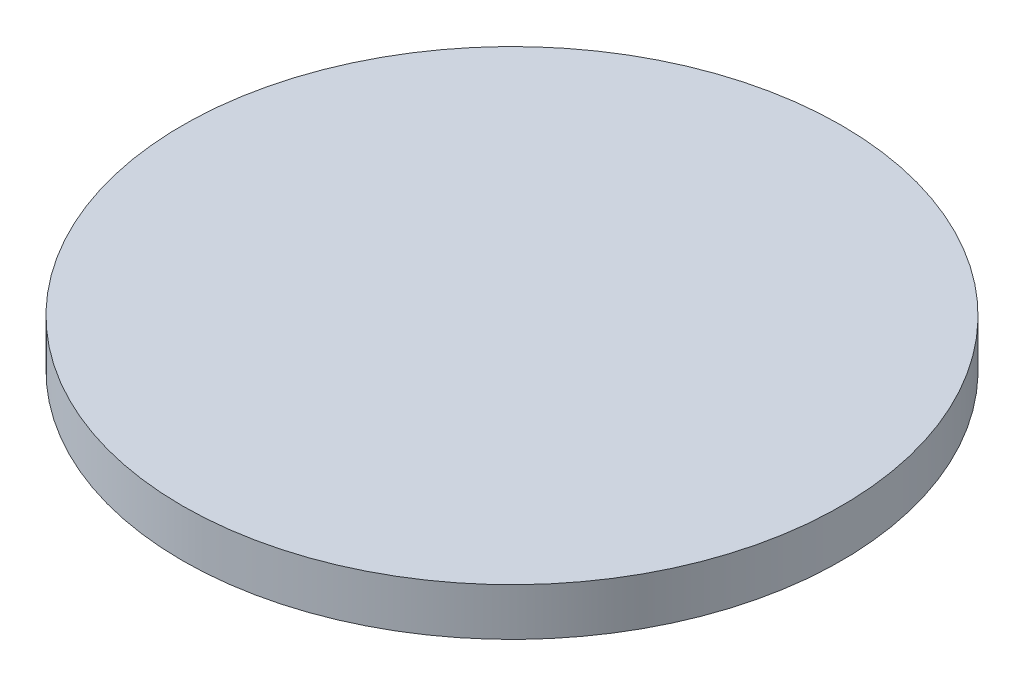
ISO-10303-21;
HEADER;
FILE_DESCRIPTION(('STEP AP214'),'2;1');
FILE_NAME('part.step','',(''),(''),'','','');
FILE_SCHEMA(('AUTOMOTIVE_DESIGN { 1 0 10303 214 1 1 1 1 }'));
ENDSEC;
DATA;
#1=APPLICATION_CONTEXT('core data for automotive mechanical design processes');
#2=APPLICATION_PROTOCOL_DEFINITION('international standard','automotive_design',2000,#1);
#3=PRODUCT_CONTEXT('',#1,'mechanical');
#4=PRODUCT('Part','Part','',(#3));
#5=PRODUCT_RELATED_PRODUCT_CATEGORY('part','',(#4));
#6=PRODUCT_DEFINITION_FORMATION('','',#4);
#7=PRODUCT_DEFINITION_CONTEXT('part definition',#1,'design');
#8=PRODUCT_DEFINITION('design','',#6,#7);
#9=PRODUCT_DEFINITION_SHAPE('','',#8);
#10=(LENGTH_UNIT() NAMED_UNIT(*) SI_UNIT(.MILLI.,.METRE.));
#11=(NAMED_UNIT(*) PLANE_ANGLE_UNIT() SI_UNIT($,.RADIAN.));
#12=(NAMED_UNIT(*) SI_UNIT($,.STERADIAN.) SOLID_ANGLE_UNIT());
#13=UNCERTAINTY_MEASURE_WITH_UNIT(LENGTH_MEASURE(1.E-05),#10,'distance_accuracy_value','');
#14=(GEOMETRIC_REPRESENTATION_CONTEXT(3) GLOBAL_UNCERTAINTY_ASSIGNED_CONTEXT((#13)) GLOBAL_UNIT_ASSIGNED_CONTEXT((#10,
#11,#12)) REPRESENTATION_CONTEXT('',''));
#15=CARTESIAN_POINT('',(0.,0.,0.));
#16=DIRECTION('',(0.,0.,1.));
#17=DIRECTION('',(1.,0.,0.));
#18=AXIS2_PLACEMENT_3D('',#15,#16,#17);
#19=CARTESIAN_POINT('',(2.58857965796101E-13,97.3498962309152,0.));
#20=DIRECTION('',(0.,1.,0.));
#21=DIRECTION('',(-1.,0.,0.));
#22=AXIS2_PLACEMENT_3D('',#19,#20,#21);
#23=PLANE('',#22);
#24=CARTESIAN_POINT('',(0.,97.3498962309152,0.));
#25=DIRECTION('',(0.,1.,0.));
#26=DIRECTION('',(0.,0.,1.));
#27=AXIS2_PLACEMENT_3D('',#24,#25,#26);
#28=CIRCLE('',#27,5.90592895500874);
#29=CARTESIAN_POINT('',(0.,97.3498962309152,5.90592895500874));
#30=VERTEX_POINT('',#29);
#31=EDGE_CURVE('E38',#30,#30,#28,.T.);
#32=ORIENTED_EDGE('',*,*,#31,.F.);
#33=EDGE_LOOP('',(#32));
#34=FACE_BOUND('',#33,.T.);
#35=ADVANCED_FACE('F32',(#34),#23,.F.);
#36=CARTESIAN_POINT('',(2.58857965796101E-13,98.1998962309152,0.));
#37=DIRECTION('',(0.,1.,0.));
#38=DIRECTION('',(-1.,0.,0.));
#39=AXIS2_PLACEMENT_3D('',#36,#37,#38);
#40=PLANE('',#39);
#41=CARTESIAN_POINT('',(0.,98.1998962309152,0.));
#42=DIRECTION('',(0.,1.,0.));
#43=DIRECTION('',(0.,0.,1.));
#44=AXIS2_PLACEMENT_3D('',#41,#42,#43);
#45=CIRCLE('',#44,5.90592895500874);
#46=CARTESIAN_POINT('',(0.,98.1998962309152,5.90592895500874));
#47=VERTEX_POINT('',#46);
#48=EDGE_CURVE('E11',#47,#47,#45,.T.);
#49=ORIENTED_EDGE('',*,*,#48,.T.);
#50=EDGE_LOOP('',(#49));
#51=FACE_BOUND('',#50,.T.);
#52=ADVANCED_FACE('F48',(#51),#40,.T.);
#53=CARTESIAN_POINT('',(0.,97.3498962309152,0.));
#54=DIRECTION('',(0.,1.,0.));
#55=DIRECTION('',(0.,0.,1.));
#56=AXIS2_PLACEMENT_3D('',#53,#54,#55);
#57=CYLINDRICAL_SURFACE('',#56,5.90592895500874);
#58=ORIENTED_EDGE('',*,*,#31,.T.);
#59=EDGE_LOOP('',(#58));
#60=FACE_BOUND('',#59,.T.);
#61=ORIENTED_EDGE('',*,*,#48,.F.);
#62=EDGE_LOOP('',(#61));
#63=FACE_BOUND('',#62,.T.);
#64=ADVANCED_FACE('F44',(#60,#63),#57,.T.);
#65=CLOSED_SHELL('',(#35,#52,#64));
#66=MANIFOLD_SOLID_BREP('B2',#65);
#67=ADVANCED_BREP_SHAPE_REPRESENTATION('',(#18,#66),#14);
#68=SHAPE_DEFINITION_REPRESENTATION(#9,#67);
ENDSEC;
END-ISO-10303-21;
